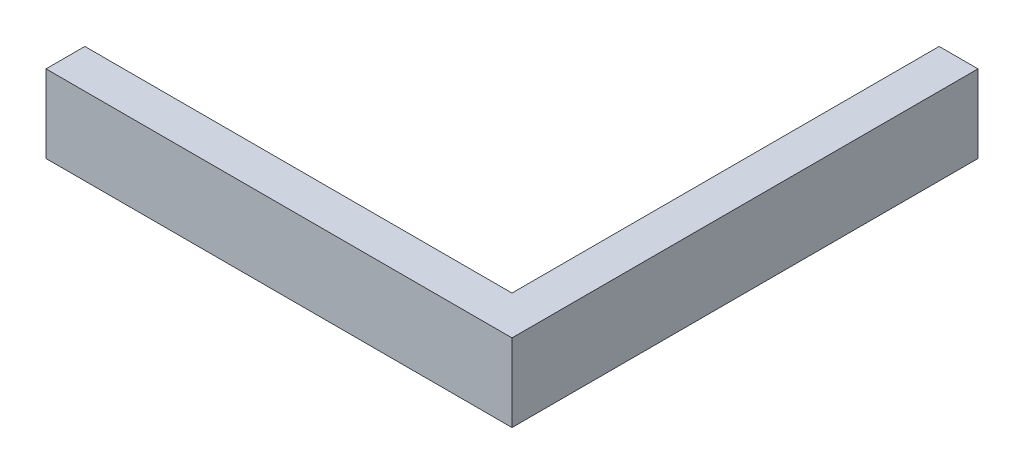
ISO-10303-21;
HEADER;
FILE_DESCRIPTION(('STEP AP214'),'2;1');
FILE_NAME('part.step','',(''),(''),'','','');
FILE_SCHEMA(('AUTOMOTIVE_DESIGN { 1 0 10303 214 1 1 1 1 }'));
ENDSEC;
DATA;
#1=APPLICATION_CONTEXT('core data for automotive mechanical design processes');
#2=APPLICATION_PROTOCOL_DEFINITION('international standard','automotive_design',2000,#1);
#3=PRODUCT_CONTEXT('',#1,'mechanical');
#4=PRODUCT('Part','Part','',(#3));
#5=PRODUCT_RELATED_PRODUCT_CATEGORY('part','',(#4));
#6=PRODUCT_DEFINITION_FORMATION('','',#4);
#7=PRODUCT_DEFINITION_CONTEXT('part definition',#1,'design');
#8=PRODUCT_DEFINITION('design','',#6,#7);
#9=PRODUCT_DEFINITION_SHAPE('','',#8);
#10=(LENGTH_UNIT() NAMED_UNIT(*) SI_UNIT(.MILLI.,.METRE.));
#11=(NAMED_UNIT(*) PLANE_ANGLE_UNIT() SI_UNIT($,.RADIAN.));
#12=(NAMED_UNIT(*) SI_UNIT($,.STERADIAN.) SOLID_ANGLE_UNIT());
#13=UNCERTAINTY_MEASURE_WITH_UNIT(LENGTH_MEASURE(1.E-05),#10,'distance_accuracy_value','');
#14=(GEOMETRIC_REPRESENTATION_CONTEXT(3) GLOBAL_UNCERTAINTY_ASSIGNED_CONTEXT((#13)) GLOBAL_UNIT_ASSIGNED_CONTEXT((#10,
#11,#12)) REPRESENTATION_CONTEXT('',''));
#15=CARTESIAN_POINT('',(0.,0.,0.));
#16=DIRECTION('',(0.,0.,1.));
#17=DIRECTION('',(1.,0.,0.));
#18=AXIS2_PLACEMENT_3D('',#15,#16,#17);
#19=CARTESIAN_POINT('',(-30.,10.,30.));
#20=DIRECTION('',(1.,0.,0.));
#21=DIRECTION('',(0.,0.,-1.));
#22=AXIS2_PLACEMENT_3D('',#19,#20,#21);
#23=PLANE('',#22);
#24=DIRECTION('',(0.,0.,1.));
#25=VECTOR('',#24,1.);
#26=CARTESIAN_POINT('',(-30.,10.,30.));
#27=LINE('',#26,#25);
#28=CARTESIAN_POINT('',(-30.,10.,25.));
#29=VERTEX_POINT('',#28);
#30=CARTESIAN_POINT('',(-30.,10.,30.));
#31=VERTEX_POINT('',#30);
#32=EDGE_CURVE('E78',#29,#31,#27,.T.);
#33=ORIENTED_EDGE('',*,*,#32,.F.);
#34=DIRECTION('',(0.,1.,0.));
#35=VECTOR('',#34,1.);
#36=CARTESIAN_POINT('',(-30.,0.,25.));
#37=LINE('',#36,#35);
#38=CARTESIAN_POINT('',(-30.,0.,25.));
#39=VERTEX_POINT('',#38);
#40=EDGE_CURVE('E98',#39,#29,#37,.T.);
#41=ORIENTED_EDGE('',*,*,#40,.F.);
#42=DIRECTION('',(0.,0.,1.));
#43=VECTOR('',#42,1.);
#44=CARTESIAN_POINT('',(-30.,0.,30.));
#45=LINE('',#44,#43);
#46=CARTESIAN_POINT('',(-30.,0.,30.));
#47=VERTEX_POINT('',#46);
#48=EDGE_CURVE('E106',#39,#47,#45,.T.);
#49=ORIENTED_EDGE('',*,*,#48,.T.);
#50=DIRECTION('',(0.,-1.,0.));
#51=VECTOR('',#50,1.);
#52=CARTESIAN_POINT('',(-30.,10.,30.));
#53=LINE('',#52,#51);
#54=EDGE_CURVE('E11',#31,#47,#53,.T.);
#55=ORIENTED_EDGE('',*,*,#54,.F.);
#56=EDGE_LOOP('',(#33,#41,#49,#55));
#57=FACE_BOUND('',#56,.T.);
#58=ADVANCED_FACE('F33',(#57),#23,.F.);
#59=CARTESIAN_POINT('',(30.,10.,30.));
#60=DIRECTION('',(0.,0.,-1.));
#61=DIRECTION('',(-1.,0.,0.));
#62=AXIS2_PLACEMENT_3D('',#59,#60,#61);
#63=PLANE('',#62);
#64=DIRECTION('',(1.,0.,0.));
#65=VECTOR('',#64,1.);
#66=CARTESIAN_POINT('',(30.,0.,30.));
#67=LINE('',#66,#65);
#68=CARTESIAN_POINT('',(30.,0.,30.));
#69=VERTEX_POINT('',#68);
#70=EDGE_CURVE('E110',#47,#69,#67,.T.);
#71=ORIENTED_EDGE('',*,*,#70,.T.);
#72=DIRECTION('',(0.,-1.,0.));
#73=VECTOR('',#72,1.);
#74=CARTESIAN_POINT('',(30.,10.,30.));
#75=LINE('',#74,#73);
#76=CARTESIAN_POINT('',(30.,10.,30.));
#77=VERTEX_POINT('',#76);
#78=EDGE_CURVE('E40',#77,#69,#75,.T.);
#79=ORIENTED_EDGE('',*,*,#78,.F.);
#80=DIRECTION('',(1.,0.,0.));
#81=VECTOR('',#80,1.);
#82=CARTESIAN_POINT('',(30.,10.,30.));
#83=LINE('',#82,#81);
#84=EDGE_CURVE('E133',#31,#77,#83,.T.);
#85=ORIENTED_EDGE('',*,*,#84,.F.);
#86=ORIENTED_EDGE('',*,*,#54,.T.);
#87=EDGE_LOOP('',(#71,#79,#85,#86));
#88=FACE_BOUND('',#87,.T.);
#89=ADVANCED_FACE('F152',(#88),#63,.F.);
#90=CARTESIAN_POINT('',(30.,10.,30.));
#91=DIRECTION('',(-1.,0.,0.));
#92=DIRECTION('',(0.,0.,1.));
#93=AXIS2_PLACEMENT_3D('',#90,#91,#92);
#94=PLANE('',#93);
#95=DIRECTION('',(0.,0.,-1.));
#96=VECTOR('',#95,1.);
#97=CARTESIAN_POINT('',(30.,0.,30.));
#98=LINE('',#97,#96);
#99=CARTESIAN_POINT('',(30.,0.,-30.));
#100=VERTEX_POINT('',#99);
#101=EDGE_CURVE('E73',#69,#100,#98,.T.);
#102=ORIENTED_EDGE('',*,*,#101,.T.);
#103=DIRECTION('',(0.,-1.,0.));
#104=VECTOR('',#103,1.);
#105=CARTESIAN_POINT('',(30.,10.,-30.));
#106=LINE('',#105,#104);
#107=CARTESIAN_POINT('',(30.,10.,-30.));
#108=VERTEX_POINT('',#107);
#109=EDGE_CURVE('E124',#108,#100,#106,.T.);
#110=ORIENTED_EDGE('',*,*,#109,.F.);
#111=DIRECTION('',(0.,0.,-1.));
#112=VECTOR('',#111,1.);
#113=CARTESIAN_POINT('',(30.,10.,30.));
#114=LINE('',#113,#112);
#115=EDGE_CURVE('E56',#77,#108,#114,.T.);
#116=ORIENTED_EDGE('',*,*,#115,.F.);
#117=ORIENTED_EDGE('',*,*,#78,.T.);
#118=EDGE_LOOP('',(#102,#110,#116,#117));
#119=FACE_BOUND('',#118,.T.);
#120=ADVANCED_FACE('F126',(#119),#94,.F.);
#121=CARTESIAN_POINT('',(30.,10.,-30.));
#122=DIRECTION('',(0.,0.,1.));
#123=DIRECTION('',(1.,0.,0.));
#124=AXIS2_PLACEMENT_3D('',#121,#122,#123);
#125=PLANE('',#124);
#126=DIRECTION('',(-1.,0.,0.));
#127=VECTOR('',#126,1.);
#128=CARTESIAN_POINT('',(30.,0.,-30.));
#129=LINE('',#128,#127);
#130=CARTESIAN_POINT('',(25.,0.,-30.));
#131=VERTEX_POINT('',#130);
#132=EDGE_CURVE('E121',#100,#131,#129,.T.);
#133=ORIENTED_EDGE('',*,*,#132,.T.);
#134=DIRECTION('',(0.,1.,0.));
#135=VECTOR('',#134,1.);
#136=CARTESIAN_POINT('',(25.,0.,-30.));
#137=LINE('',#136,#135);
#138=CARTESIAN_POINT('',(25.,10.,-30.));
#139=VERTEX_POINT('',#138);
#140=EDGE_CURVE('E111',#131,#139,#137,.T.);
#141=ORIENTED_EDGE('',*,*,#140,.T.);
#142=DIRECTION('',(-1.,0.,0.));
#143=VECTOR('',#142,1.);
#144=CARTESIAN_POINT('',(30.,10.,-30.));
#145=LINE('',#144,#143);
#146=EDGE_CURVE('E117',#108,#139,#145,.T.);
#147=ORIENTED_EDGE('',*,*,#146,.F.);
#148=ORIENTED_EDGE('',*,*,#109,.T.);
#149=EDGE_LOOP('',(#133,#141,#147,#148));
#150=FACE_BOUND('',#149,.T.);
#151=ADVANCED_FACE('F130',(#150),#125,.F.);
#152=CARTESIAN_POINT('',(0.,10.,0.));
#153=DIRECTION('',(0.,1.,0.));
#154=DIRECTION('',(0.,0.,1.));
#155=AXIS2_PLACEMENT_3D('',#152,#153,#154);
#156=PLANE('',#155);
#157=DIRECTION('',(0.,0.,-1.));
#158=VECTOR('',#157,1.);
#159=CARTESIAN_POINT('',(25.,10.,-30.));
#160=LINE('',#159,#158);
#161=CARTESIAN_POINT('',(25.,10.,25.));
#162=VERTEX_POINT('',#161);
#163=EDGE_CURVE('E102',#162,#139,#160,.T.);
#164=ORIENTED_EDGE('',*,*,#163,.F.);
#165=DIRECTION('',(1.,0.,0.));
#166=VECTOR('',#165,1.);
#167=CARTESIAN_POINT('',(-30.,10.,25.));
#168=LINE('',#167,#166);
#169=EDGE_CURVE('E139',#29,#162,#168,.T.);
#170=ORIENTED_EDGE('',*,*,#169,.F.);
#171=ORIENTED_EDGE('',*,*,#32,.T.);
#172=ORIENTED_EDGE('',*,*,#84,.T.);
#173=ORIENTED_EDGE('',*,*,#115,.T.);
#174=ORIENTED_EDGE('',*,*,#146,.T.);
#175=EDGE_LOOP('',(#164,#170,#171,#172,#173,#174));
#176=FACE_BOUND('',#175,.T.);
#177=ADVANCED_FACE('F141',(#176),#156,.T.);
#178=CARTESIAN_POINT('',(0.,0.,0.));
#179=DIRECTION('',(0.,1.,0.));
#180=DIRECTION('',(0.,0.,1.));
#181=AXIS2_PLACEMENT_3D('',#178,#179,#180);
#182=PLANE('',#181);
#183=DIRECTION('',(1.,0.,0.));
#184=VECTOR('',#183,1.);
#185=CARTESIAN_POINT('',(-30.,0.,25.));
#186=LINE('',#185,#184);
#187=CARTESIAN_POINT('',(25.,0.,25.));
#188=VERTEX_POINT('',#187);
#189=EDGE_CURVE('E94',#39,#188,#186,.T.);
#190=ORIENTED_EDGE('',*,*,#189,.T.);
#191=DIRECTION('',(0.,0.,-1.));
#192=VECTOR('',#191,1.);
#193=CARTESIAN_POINT('',(25.,0.,-30.));
#194=LINE('',#193,#192);
#195=EDGE_CURVE('E47',#188,#131,#194,.T.);
#196=ORIENTED_EDGE('',*,*,#195,.T.);
#197=ORIENTED_EDGE('',*,*,#132,.F.);
#198=ORIENTED_EDGE('',*,*,#101,.F.);
#199=ORIENTED_EDGE('',*,*,#70,.F.);
#200=ORIENTED_EDGE('',*,*,#48,.F.);
#201=EDGE_LOOP('',(#190,#196,#197,#198,#199,#200));
#202=FACE_BOUND('',#201,.T.);
#203=ADVANCED_FACE('F109',(#202),#182,.F.);
#204=CARTESIAN_POINT('',(25.,0.,-30.));
#205=DIRECTION('',(1.,0.,0.));
#206=DIRECTION('',(0.,0.,-1.));
#207=AXIS2_PLACEMENT_3D('',#204,#205,#206);
#208=PLANE('',#207);
#209=ORIENTED_EDGE('',*,*,#163,.T.);
#210=ORIENTED_EDGE('',*,*,#140,.F.);
#211=ORIENTED_EDGE('',*,*,#195,.F.);
#212=DIRECTION('',(0.,1.,0.));
#213=VECTOR('',#212,1.);
#214=CARTESIAN_POINT('',(25.,0.,25.));
#215=LINE('',#214,#213);
#216=EDGE_CURVE('E99',#188,#162,#215,.T.);
#217=ORIENTED_EDGE('',*,*,#216,.T.);
#218=EDGE_LOOP('',(#209,#210,#211,#217));
#219=FACE_BOUND('',#218,.T.);
#220=ADVANCED_FACE('F142',(#219),#208,.F.);
#221=CARTESIAN_POINT('',(-30.,0.,25.));
#222=DIRECTION('',(0.,0.,1.));
#223=DIRECTION('',(1.,0.,0.));
#224=AXIS2_PLACEMENT_3D('',#221,#222,#223);
#225=PLANE('',#224);
#226=ORIENTED_EDGE('',*,*,#169,.T.);
#227=ORIENTED_EDGE('',*,*,#216,.F.);
#228=ORIENTED_EDGE('',*,*,#189,.F.);
#229=ORIENTED_EDGE('',*,*,#40,.T.);
#230=EDGE_LOOP('',(#226,#227,#228,#229));
#231=FACE_BOUND('',#230,.T.);
#232=ADVANCED_FACE('F97',(#231),#225,.F.);
#233=CLOSED_SHELL('',(#58,#89,#120,#151,#177,#203,#220,#232));
#234=MANIFOLD_SOLID_BREP('B2',#233);
#235=ADVANCED_BREP_SHAPE_REPRESENTATION('',(#18,#234),#14);
#236=SHAPE_DEFINITION_REPRESENTATION(#9,#235);
ENDSEC;
END-ISO-10303-21;
